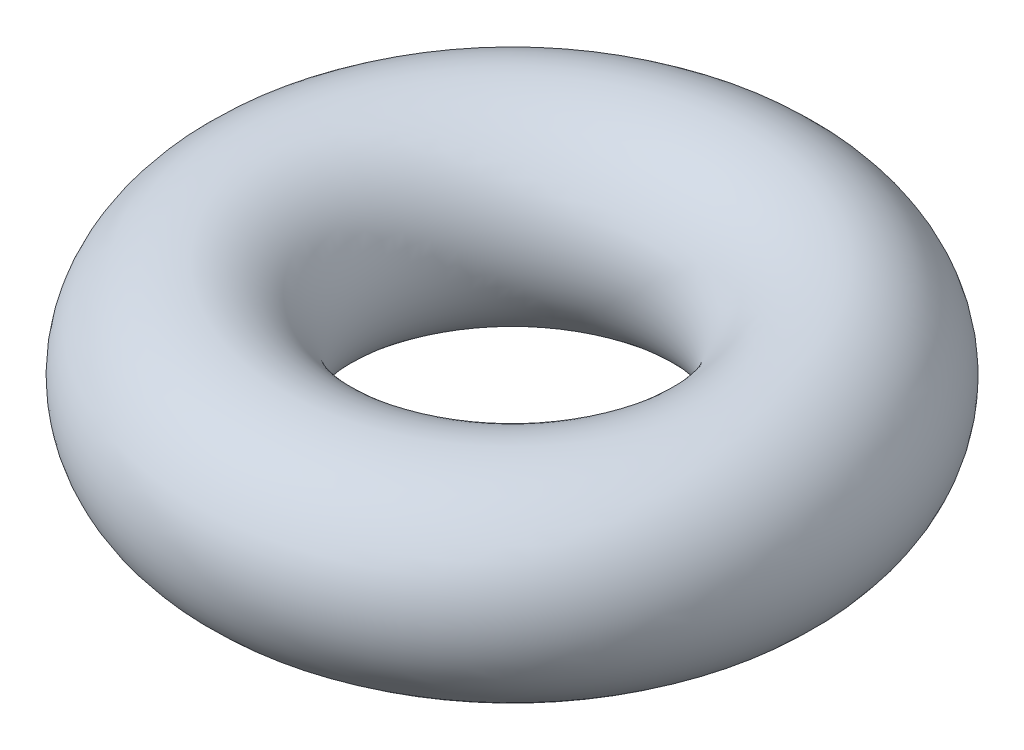
ISO-10303-21;
HEADER;
FILE_DESCRIPTION(('STEP AP214'),'2;1');
FILE_NAME('part.step','',(''),(''),'','','');
FILE_SCHEMA(('AUTOMOTIVE_DESIGN { 1 0 10303 214 1 1 1 1 }'));
ENDSEC;
DATA;
#1=APPLICATION_CONTEXT('core data for automotive mechanical design processes');
#2=APPLICATION_PROTOCOL_DEFINITION('international standard','automotive_design',2000,#1);
#3=PRODUCT_CONTEXT('',#1,'mechanical');
#4=PRODUCT('Part','Part','',(#3));
#5=PRODUCT_RELATED_PRODUCT_CATEGORY('part','',(#4));
#6=PRODUCT_DEFINITION_FORMATION('','',#4);
#7=PRODUCT_DEFINITION_CONTEXT('part definition',#1,'design');
#8=PRODUCT_DEFINITION('design','',#6,#7);
#9=PRODUCT_DEFINITION_SHAPE('','',#8);
#10=(LENGTH_UNIT() NAMED_UNIT(*) SI_UNIT(.MILLI.,.METRE.));
#11=(NAMED_UNIT(*) PLANE_ANGLE_UNIT() SI_UNIT($,.RADIAN.));
#12=(NAMED_UNIT(*) SI_UNIT($,.STERADIAN.) SOLID_ANGLE_UNIT());
#13=UNCERTAINTY_MEASURE_WITH_UNIT(LENGTH_MEASURE(1.E-05),#10,'distance_accuracy_value','');
#14=(GEOMETRIC_REPRESENTATION_CONTEXT(3) GLOBAL_UNCERTAINTY_ASSIGNED_CONTEXT((#13)) GLOBAL_UNIT_ASSIGNED_CONTEXT((#10,
#11,#12)) REPRESENTATION_CONTEXT('',''));
#15=CARTESIAN_POINT('',(0.,0.,0.));
#16=DIRECTION('',(0.,0.,1.));
#17=DIRECTION('',(1.,0.,0.));
#18=AXIS2_PLACEMENT_3D('',#15,#16,#17);
#19=CARTESIAN_POINT('',(0.,0.,0.));
#20=DIRECTION('',(0.,1.,0.));
#21=DIRECTION('',(-1.,0.,0.));
#22=AXIS2_PLACEMENT_3D('',#19,#20,#21);
#23=TOROIDAL_SURFACE('',#22,1.4,0.6);
#24=CARTESIAN_POINT('',(-2.,0.,0.));
#25=VERTEX_POINT('',#24);
#26=VERTEX_LOOP('',#25);
#27=FACE_BOUND('',#26,.T.);
#28=ADVANCED_FACE('F29',(#27),#23,.T.);
#29=CLOSED_SHELL('',(#28));
#30=MANIFOLD_SOLID_BREP('B2',#29);
#31=ADVANCED_BREP_SHAPE_REPRESENTATION('',(#18,#30),#14);
#32=SHAPE_DEFINITION_REPRESENTATION(#9,#31);
ENDSEC;
END-ISO-10303-21;
